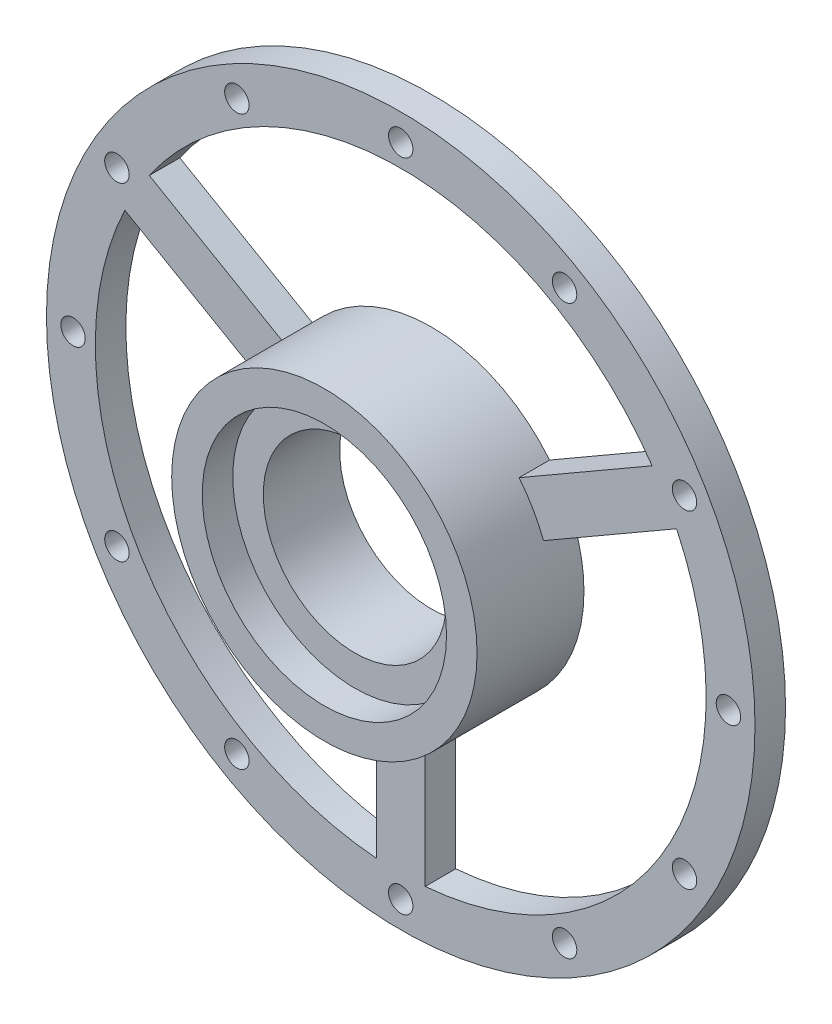
ISO-10303-21;
HEADER;
FILE_DESCRIPTION(('STEP AP214'),'2;1');
FILE_NAME('part.step','',(''),(''),'','','');
FILE_SCHEMA(('AUTOMOTIVE_DESIGN { 1 0 10303 214 1 1 1 1 }'));
ENDSEC;
DATA;
#1=APPLICATION_CONTEXT('core data for automotive mechanical design processes');
#2=APPLICATION_PROTOCOL_DEFINITION('international standard','automotive_design',2000,#1);
#3=PRODUCT_CONTEXT('',#1,'mechanical');
#4=PRODUCT('Part','Part','',(#3));
#5=PRODUCT_RELATED_PRODUCT_CATEGORY('part','',(#4));
#6=PRODUCT_DEFINITION_FORMATION('','',#4);
#7=PRODUCT_DEFINITION_CONTEXT('part definition',#1,'design');
#8=PRODUCT_DEFINITION('design','',#6,#7);
#9=PRODUCT_DEFINITION_SHAPE('','',#8);
#10=(LENGTH_UNIT() NAMED_UNIT(*) SI_UNIT(.MILLI.,.METRE.));
#11=(NAMED_UNIT(*) PLANE_ANGLE_UNIT() SI_UNIT($,.RADIAN.));
#12=(NAMED_UNIT(*) SI_UNIT($,.STERADIAN.) SOLID_ANGLE_UNIT());
#13=UNCERTAINTY_MEASURE_WITH_UNIT(LENGTH_MEASURE(1.E-05),#10,'distance_accuracy_value','');
#14=(GEOMETRIC_REPRESENTATION_CONTEXT(3) GLOBAL_UNCERTAINTY_ASSIGNED_CONTEXT((#13)) GLOBAL_UNIT_ASSIGNED_CONTEXT((#10,
#11,#12)) REPRESENTATION_CONTEXT('',''));
#15=CARTESIAN_POINT('',(0.,0.,0.));
#16=DIRECTION('',(0.,0.,1.));
#17=DIRECTION('',(1.,0.,0.));
#18=AXIS2_PLACEMENT_3D('',#15,#16,#17);
#19=CARTESIAN_POINT('',(0.,116.,0.));
#20=DIRECTION('',(0.,0.,1.));
#21=DIRECTION('',(1.,0.,0.));
#22=AXIS2_PLACEMENT_3D('',#19,#20,#21);
#23=PLANE('',#22);
#24=DIRECTION('',(-0.866025403784439,0.5,0.));
#25=VECTOR('',#24,1.);
#26=CARTESIAN_POINT('',(-4.00000000000001,-6.92820323027553,0.));
#27=LINE('',#26,#25);
#28=CARTESIAN_POINT('',(-46.743420546325,17.7497221282306,0.));
#29=VERTEX_POINT('',#28);
#30=CARTESIAN_POINT('',(-90.324967419629,42.9115399472329,0.));
#31=VERTEX_POINT('',#30);
#32=EDGE_CURVE('E173',#29,#31,#27,.T.);
#33=ORIENTED_EDGE('',*,*,#32,.T.);
#34=CARTESIAN_POINT('',(0.,0.,0.));
#35=DIRECTION('',(0.,0.,1.));
#36=DIRECTION('',(1.,0.,0.));
#37=AXIS2_PLACEMENT_3D('',#34,#35,#36);
#38=CIRCLE('',#37,100.);
#39=CARTESIAN_POINT('',(-7.99999999999963,-99.6794863550169,0.));
#40=VERTEX_POINT('',#39);
#41=EDGE_CURVE('E184',#40,#31,#38,.F.);
#42=ORIENTED_EDGE('',*,*,#41,.F.);
#43=DIRECTION('',(0.,-1.,0.));
#44=VECTOR('',#43,1.);
#45=CARTESIAN_POINT('',(-7.99999999999976,0.,0.));
#46=LINE('',#45,#44);
#47=CARTESIAN_POINT('',(-7.99999999999972,-49.3558507170123,0.));
#48=VERTEX_POINT('',#47);
#49=EDGE_CURVE('E103',#48,#40,#46,.T.);
#50=ORIENTED_EDGE('',*,*,#49,.F.);
#51=CARTESIAN_POINT('',(0.,0.,0.));
#52=DIRECTION('',(0.,0.,1.));
#53=DIRECTION('',(1.,0.,0.));
#54=AXIS2_PLACEMENT_3D('',#51,#52,#53);
#55=CIRCLE('',#54,50.);
#56=EDGE_CURVE('E192',#29,#48,#55,.T.);
#57=ORIENTED_EDGE('',*,*,#56,.F.);
#58=EDGE_LOOP('',(#33,#42,#50,#57));
#59=FACE_BOUND('',#58,.T.);
#60=CARTESIAN_POINT('',(0.,0.,0.));
#61=DIRECTION('',(0.,0.,1.));
#62=DIRECTION('',(1.,0.,0.));
#63=AXIS2_PLACEMENT_3D('',#60,#61,#62);
#64=CIRCLE('',#63,30.);
#65=CARTESIAN_POINT('',(30.,0.,0.));
#66=VERTEX_POINT('',#65);
#67=EDGE_CURVE('E12',#66,#66,#64,.T.);
#68=ORIENTED_EDGE('',*,*,#67,.T.);
#69=EDGE_LOOP('',(#68));
#70=FACE_BOUND('',#69,.T.);
#71=CARTESIAN_POINT('',(0.,0.,0.));
#72=DIRECTION('',(0.,0.,1.));
#73=DIRECTION('',(1.,0.,0.));
#74=AXIS2_PLACEMENT_3D('',#71,#72,#73);
#75=CIRCLE('',#74,116.);
#76=CARTESIAN_POINT('',(116.,0.,0.));
#77=VERTEX_POINT('',#76);
#78=EDGE_CURVE('E270',#77,#77,#75,.T.);
#79=ORIENTED_EDGE('',*,*,#78,.F.);
#80=EDGE_LOOP('',(#79));
#81=FACE_BOUND('',#80,.T.);
#82=CARTESIAN_POINT('',(92.9245258260702,53.6500000000001,0.));
#83=DIRECTION('',(0.,0.,1.));
#84=DIRECTION('',(1.,0.,0.));
#85=AXIS2_PLACEMENT_3D('',#82,#83,#84);
#86=CIRCLE('',#85,4.00000000000001);
#87=CARTESIAN_POINT('',(96.9245258260702,53.6500000000001,0.));
#88=VERTEX_POINT('',#87);
#89=EDGE_CURVE('E306',#88,#88,#86,.F.);
#90=ORIENTED_EDGE('',*,*,#89,.F.);
#91=EDGE_LOOP('',(#90));
#92=FACE_BOUND('',#91,.T.);
#93=CARTESIAN_POINT('',(53.65,92.9245258260703,0.));
#94=DIRECTION('',(0.,0.,1.));
#95=DIRECTION('',(1.,0.,0.));
#96=AXIS2_PLACEMENT_3D('',#93,#94,#95);
#97=CIRCLE('',#96,4.00000000000001);
#98=CARTESIAN_POINT('',(57.65,92.9245258260703,0.));
#99=VERTEX_POINT('',#98);
#100=EDGE_CURVE('E300',#99,#99,#97,.F.);
#101=ORIENTED_EDGE('',*,*,#100,.F.);
#102=EDGE_LOOP('',(#101));
#103=FACE_BOUND('',#102,.T.);
#104=CARTESIAN_POINT('',(0.,107.3,0.));
#105=DIRECTION('',(0.,0.,1.));
#106=DIRECTION('',(1.,0.,0.));
#107=AXIS2_PLACEMENT_3D('',#104,#105,#106);
#108=CIRCLE('',#107,4.);
#109=CARTESIAN_POINT('',(3.99999999999999,107.3,0.));
#110=VERTEX_POINT('',#109);
#111=EDGE_CURVE('E293',#110,#110,#108,.F.);
#112=ORIENTED_EDGE('',*,*,#111,.F.);
#113=EDGE_LOOP('',(#112));
#114=FACE_BOUND('',#113,.T.);
#115=CARTESIAN_POINT('',(-53.65,92.9245258260703,0.));
#116=DIRECTION('',(0.,0.,1.));
#117=DIRECTION('',(1.,0.,0.));
#118=AXIS2_PLACEMENT_3D('',#115,#116,#117);
#119=CIRCLE('',#118,4.00000000000001);
#120=CARTESIAN_POINT('',(-49.65,92.9245258260703,0.));
#121=VERTEX_POINT('',#120);
#122=EDGE_CURVE('E292',#121,#121,#119,.F.);
#123=ORIENTED_EDGE('',*,*,#122,.F.);
#124=EDGE_LOOP('',(#123));
#125=FACE_BOUND('',#124,.T.);
#126=CARTESIAN_POINT('',(-92.9245258260703,53.65,0.));
#127=DIRECTION('',(0.,0.,1.));
#128=DIRECTION('',(1.,0.,0.));
#129=AXIS2_PLACEMENT_3D('',#126,#127,#128);
#130=CIRCLE('',#129,4.00000000000001);
#131=CARTESIAN_POINT('',(-88.9245258260703,53.65,0.));
#132=VERTEX_POINT('',#131);
#133=EDGE_CURVE('E328',#132,#132,#130,.F.);
#134=ORIENTED_EDGE('',*,*,#133,.F.);
#135=EDGE_LOOP('',(#134));
#136=FACE_BOUND('',#135,.T.);
#137=CARTESIAN_POINT('',(-107.3,0.,0.));
#138=DIRECTION('',(0.,0.,1.));
#139=DIRECTION('',(1.,0.,0.));
#140=AXIS2_PLACEMENT_3D('',#137,#138,#139);
#141=CIRCLE('',#140,4.00000000000001);
#142=CARTESIAN_POINT('',(-103.3,0.,0.));
#143=VERTEX_POINT('',#142);
#144=EDGE_CURVE('E322',#143,#143,#141,.F.);
#145=ORIENTED_EDGE('',*,*,#144,.F.);
#146=EDGE_LOOP('',(#145));
#147=FACE_BOUND('',#146,.T.);
#148=CARTESIAN_POINT('',(-92.9245258260703,-53.65,0.));
#149=DIRECTION('',(0.,0.,1.));
#150=DIRECTION('',(1.,0.,0.));
#151=AXIS2_PLACEMENT_3D('',#148,#149,#150);
#152=CIRCLE('',#151,4.00000000000001);
#153=CARTESIAN_POINT('',(-88.9245258260703,-53.65,0.));
#154=VERTEX_POINT('',#153);
#155=EDGE_CURVE('E316',#154,#154,#152,.F.);
#156=ORIENTED_EDGE('',*,*,#155,.F.);
#157=EDGE_LOOP('',(#156));
#158=FACE_BOUND('',#157,.T.);
#159=CARTESIAN_POINT('',(-53.65,-92.9245258260702,0.));
#160=DIRECTION('',(0.,0.,1.));
#161=DIRECTION('',(1.,0.,0.));
#162=AXIS2_PLACEMENT_3D('',#159,#160,#161);
#163=CIRCLE('',#162,4.);
#164=CARTESIAN_POINT('',(-49.65,-92.9245258260702,0.));
#165=VERTEX_POINT('',#164);
#166=EDGE_CURVE('E267',#165,#165,#163,.F.);
#167=ORIENTED_EDGE('',*,*,#166,.F.);
#168=EDGE_LOOP('',(#167));
#169=FACE_BOUND('',#168,.T.);
#170=CARTESIAN_POINT('',(107.3,0.,0.));
#171=DIRECTION('',(0.,0.,1.));
#172=DIRECTION('',(1.,0.,0.));
#173=AXIS2_PLACEMENT_3D('',#170,#171,#172);
#174=CIRCLE('',#173,3.99999999999999);
#175=CARTESIAN_POINT('',(111.3,0.,0.));
#176=VERTEX_POINT('',#175);
#177=EDGE_CURVE('E274',#176,#176,#174,.F.);
#178=ORIENTED_EDGE('',*,*,#177,.F.);
#179=EDGE_LOOP('',(#178));
#180=FACE_BOUND('',#179,.T.);
#181=CARTESIAN_POINT('',(92.9245258260703,-53.6499999999999,0.));
#182=DIRECTION('',(0.,0.,1.));
#183=DIRECTION('',(1.,0.,0.));
#184=AXIS2_PLACEMENT_3D('',#181,#182,#183);
#185=CIRCLE('',#184,3.99999999999999);
#186=CARTESIAN_POINT('',(96.9245258260703,-53.6499999999999,0.));
#187=VERTEX_POINT('',#186);
#188=EDGE_CURVE('E275',#187,#187,#185,.F.);
#189=ORIENTED_EDGE('',*,*,#188,.F.);
#190=EDGE_LOOP('',(#189));
#191=FACE_BOUND('',#190,.T.);
#192=CARTESIAN_POINT('',(53.6500000000001,-92.9245258260702,0.));
#193=DIRECTION('',(0.,0.,1.));
#194=DIRECTION('',(1.,0.,0.));
#195=AXIS2_PLACEMENT_3D('',#192,#193,#194);
#196=CIRCLE('',#195,4.00000000000001);
#197=CARTESIAN_POINT('',(57.6500000000001,-92.9245258260702,0.));
#198=VERTEX_POINT('',#197);
#199=EDGE_CURVE('E282',#198,#198,#196,.F.);
#200=ORIENTED_EDGE('',*,*,#199,.F.);
#201=EDGE_LOOP('',(#200));
#202=FACE_BOUND('',#201,.T.);
#203=CARTESIAN_POINT('',(0.,-107.3,0.));
#204=DIRECTION('',(0.,0.,1.));
#205=DIRECTION('',(1.,0.,0.));
#206=AXIS2_PLACEMENT_3D('',#203,#204,#205);
#207=CIRCLE('',#206,4.);
#208=CARTESIAN_POINT('',(4.,-107.3,0.));
#209=VERTEX_POINT('',#208);
#210=EDGE_CURVE('E266',#209,#209,#207,.F.);
#211=ORIENTED_EDGE('',*,*,#210,.F.);
#212=EDGE_LOOP('',(#211));
#213=FACE_BOUND('',#212,.T.);
#214=DIRECTION('',(0.866025403784438,0.5,0.));
#215=VECTOR('',#214,1.);
#216=CARTESIAN_POINT('',(-3.99999999999983,6.92820323027521,0.));
#217=LINE('',#216,#215);
#218=CARTESIAN_POINT('',(38.7434205463252,31.6061285887814,0.));
#219=VERTEX_POINT('',#218);
#220=CARTESIAN_POINT('',(82.3249674196291,56.7679464077837,0.));
#221=VERTEX_POINT('',#220);
#222=EDGE_CURVE('E238',#219,#221,#217,.T.);
#223=ORIENTED_EDGE('',*,*,#222,.T.);
#224=CARTESIAN_POINT('',(0.,0.,0.));
#225=DIRECTION('',(0.,0.,1.));
#226=DIRECTION('',(1.,0.,0.));
#227=AXIS2_PLACEMENT_3D('',#224,#225,#226);
#228=CIRCLE('',#227,100.);
#229=CARTESIAN_POINT('',(-82.324967419629,56.767946407784,0.));
#230=VERTEX_POINT('',#229);
#231=EDGE_CURVE('E253',#230,#221,#228,.F.);
#232=ORIENTED_EDGE('',*,*,#231,.F.);
#233=DIRECTION('',(-0.866025403784439,0.5,0.));
#234=VECTOR('',#233,1.);
#235=CARTESIAN_POINT('',(3.99999999999999,6.9282032302755,0.));
#236=LINE('',#235,#234);
#237=CARTESIAN_POINT('',(-38.743420546325,31.6061285887816,0.));
#238=VERTEX_POINT('',#237);
#239=EDGE_CURVE('E187',#238,#230,#236,.T.);
#240=ORIENTED_EDGE('',*,*,#239,.F.);
#241=CARTESIAN_POINT('',(0.,0.,0.));
#242=DIRECTION('',(0.,0.,1.));
#243=DIRECTION('',(1.,0.,0.));
#244=AXIS2_PLACEMENT_3D('',#241,#242,#243);
#245=CIRCLE('',#244,50.);
#246=EDGE_CURVE('E235',#219,#238,#245,.T.);
#247=ORIENTED_EDGE('',*,*,#246,.F.);
#248=EDGE_LOOP('',(#223,#232,#240,#247));
#249=FACE_BOUND('',#248,.T.);
#250=DIRECTION('',(0.,-1.,0.));
#251=VECTOR('',#250,1.);
#252=CARTESIAN_POINT('',(8.00000000000026,0.,0.));
#253=LINE('',#252,#251);
#254=CARTESIAN_POINT('',(8.0000000000003,-49.3558507170122,0.));
#255=VERTEX_POINT('',#254);
#256=CARTESIAN_POINT('',(8.00000000000029,-99.6794863550169,0.));
#257=VERTEX_POINT('',#256);
#258=EDGE_CURVE('E210',#255,#257,#253,.T.);
#259=ORIENTED_EDGE('',*,*,#258,.T.);
#260=CARTESIAN_POINT('',(0.,0.,0.));
#261=DIRECTION('',(0.,0.,1.));
#262=DIRECTION('',(1.,0.,0.));
#263=AXIS2_PLACEMENT_3D('',#260,#261,#262);
#264=CIRCLE('',#263,100.);
#265=CARTESIAN_POINT('',(90.3249674196291,42.9115399472327,0.));
#266=VERTEX_POINT('',#265);
#267=EDGE_CURVE('E225',#266,#257,#264,.F.);
#268=ORIENTED_EDGE('',*,*,#267,.F.);
#269=DIRECTION('',(0.866025403784438,0.500000000000001,0.));
#270=VECTOR('',#269,1.);
#271=CARTESIAN_POINT('',(4.0000000000002,-6.92820323027584,0.));
#272=LINE('',#271,#270);
#273=CARTESIAN_POINT('',(46.7434205463252,17.7497221282303,0.));
#274=VERTEX_POINT('',#273);
#275=EDGE_CURVE('E95',#274,#266,#272,.T.);
#276=ORIENTED_EDGE('',*,*,#275,.F.);
#277=CARTESIAN_POINT('',(0.,0.,0.));
#278=DIRECTION('',(0.,0.,1.));
#279=DIRECTION('',(1.,0.,0.));
#280=AXIS2_PLACEMENT_3D('',#277,#278,#279);
#281=CIRCLE('',#280,50.);
#282=EDGE_CURVE('E207',#255,#274,#281,.T.);
#283=ORIENTED_EDGE('',*,*,#282,.F.);
#284=EDGE_LOOP('',(#259,#268,#276,#283));
#285=FACE_BOUND('',#284,.T.);
#286=ADVANCED_FACE('F81',(#59,#70,#81,#92,#103,#114,#125,#136,#147,#158,#169,#180,#191,#202,
#213,#249,#285),#23,.F.);
#287=CARTESIAN_POINT('',(0.,50.,10.));
#288=DIRECTION('',(0.,0.,-1.));
#289=DIRECTION('',(-1.,0.,0.));
#290=AXIS2_PLACEMENT_3D('',#287,#288,#289);
#291=PLANE('',#290);
#292=CARTESIAN_POINT('',(0.,0.,10.));
#293=DIRECTION('',(0.,0.,1.));
#294=DIRECTION('',(1.,0.,0.));
#295=AXIS2_PLACEMENT_3D('',#292,#293,#294);
#296=CIRCLE('',#295,116.);
#297=CARTESIAN_POINT('',(116.,0.,10.));
#298=VERTEX_POINT('',#297);
#299=EDGE_CURVE('E337',#298,#298,#296,.T.);
#300=ORIENTED_EDGE('',*,*,#299,.T.);
#301=EDGE_LOOP('',(#300));
#302=FACE_BOUND('',#301,.T.);
#303=CARTESIAN_POINT('',(92.9245258260702,53.6500000000001,10.));
#304=DIRECTION('',(0.,0.,1.));
#305=DIRECTION('',(1.,0.,0.));
#306=AXIS2_PLACEMENT_3D('',#303,#304,#305);
#307=CIRCLE('',#306,4.00000000000001);
#308=CARTESIAN_POINT('',(96.9245258260702,53.6500000000001,10.));
#309=VERTEX_POINT('',#308);
#310=EDGE_CURVE('E278',#309,#309,#307,.T.);
#311=ORIENTED_EDGE('',*,*,#310,.F.);
#312=EDGE_LOOP('',(#311));
#313=FACE_BOUND('',#312,.T.);
#314=CARTESIAN_POINT('',(53.65,92.9245258260703,10.));
#315=DIRECTION('',(0.,0.,1.));
#316=DIRECTION('',(1.,0.,0.));
#317=AXIS2_PLACEMENT_3D('',#314,#315,#316);
#318=CIRCLE('',#317,4.00000000000001);
#319=CARTESIAN_POINT('',(57.65,92.9245258260703,10.));
#320=VERTEX_POINT('',#319);
#321=EDGE_CURVE('E303',#320,#320,#318,.T.);
#322=ORIENTED_EDGE('',*,*,#321,.F.);
#323=EDGE_LOOP('',(#322));
#324=FACE_BOUND('',#323,.T.);
#325=CARTESIAN_POINT('',(0.,107.3,10.));
#326=DIRECTION('',(0.,0.,1.));
#327=DIRECTION('',(1.,0.,0.));
#328=AXIS2_PLACEMENT_3D('',#325,#326,#327);
#329=CIRCLE('',#328,4.);
#330=CARTESIAN_POINT('',(3.99999999999999,107.3,10.));
#331=VERTEX_POINT('',#330);
#332=EDGE_CURVE('E297',#331,#331,#329,.T.);
#333=ORIENTED_EDGE('',*,*,#332,.F.);
#334=EDGE_LOOP('',(#333));
#335=FACE_BOUND('',#334,.T.);
#336=CARTESIAN_POINT('',(-53.65,92.9245258260703,10.));
#337=DIRECTION('',(0.,0.,1.));
#338=DIRECTION('',(1.,0.,0.));
#339=AXIS2_PLACEMENT_3D('',#336,#337,#338);
#340=CIRCLE('',#339,4.00000000000001);
#341=CARTESIAN_POINT('',(-49.65,92.9245258260703,10.));
#342=VERTEX_POINT('',#341);
#343=EDGE_CURVE('E289',#342,#342,#340,.T.);
#344=ORIENTED_EDGE('',*,*,#343,.F.);
#345=EDGE_LOOP('',(#344));
#346=FACE_BOUND('',#345,.T.);
#347=CARTESIAN_POINT('',(-92.9245258260703,53.65,10.));
#348=DIRECTION('',(0.,0.,1.));
#349=DIRECTION('',(1.,0.,0.));
#350=AXIS2_PLACEMENT_3D('',#347,#348,#349);
#351=CIRCLE('',#350,4.00000000000001);
#352=CARTESIAN_POINT('',(-88.9245258260703,53.65,10.));
#353=VERTEX_POINT('',#352);
#354=EDGE_CURVE('E296',#353,#353,#351,.T.);
#355=ORIENTED_EDGE('',*,*,#354,.F.);
#356=EDGE_LOOP('',(#355));
#357=FACE_BOUND('',#356,.T.);
#358=CARTESIAN_POINT('',(-107.3,0.,10.));
#359=DIRECTION('',(0.,0.,1.));
#360=DIRECTION('',(1.,0.,0.));
#361=AXIS2_PLACEMENT_3D('',#358,#359,#360);
#362=CIRCLE('',#361,4.00000000000001);
#363=CARTESIAN_POINT('',(-103.3,0.,10.));
#364=VERTEX_POINT('',#363);
#365=EDGE_CURVE('E325',#364,#364,#362,.T.);
#366=ORIENTED_EDGE('',*,*,#365,.F.);
#367=EDGE_LOOP('',(#366));
#368=FACE_BOUND('',#367,.T.);
#369=CARTESIAN_POINT('',(-92.9245258260703,-53.65,10.));
#370=DIRECTION('',(0.,0.,1.));
#371=DIRECTION('',(1.,0.,0.));
#372=AXIS2_PLACEMENT_3D('',#369,#370,#371);
#373=CIRCLE('',#372,4.00000000000001);
#374=CARTESIAN_POINT('',(-88.9245258260703,-53.65,10.));
#375=VERTEX_POINT('',#374);
#376=EDGE_CURVE('E319',#375,#375,#373,.T.);
#377=ORIENTED_EDGE('',*,*,#376,.F.);
#378=EDGE_LOOP('',(#377));
#379=FACE_BOUND('',#378,.T.);
#380=CARTESIAN_POINT('',(-53.65,-92.9245258260702,10.));
#381=DIRECTION('',(0.,0.,1.));
#382=DIRECTION('',(1.,0.,0.));
#383=AXIS2_PLACEMENT_3D('',#380,#381,#382);
#384=CIRCLE('',#383,4.);
#385=CARTESIAN_POINT('',(-49.65,-92.9245258260702,10.));
#386=VERTEX_POINT('',#385);
#387=EDGE_CURVE('E313',#386,#386,#384,.T.);
#388=ORIENTED_EDGE('',*,*,#387,.F.);
#389=EDGE_LOOP('',(#388));
#390=FACE_BOUND('',#389,.T.);
#391=CARTESIAN_POINT('',(107.3,0.,10.));
#392=DIRECTION('',(0.,0.,1.));
#393=DIRECTION('',(1.,0.,0.));
#394=AXIS2_PLACEMENT_3D('',#391,#392,#393);
#395=CIRCLE('',#394,3.99999999999999);
#396=CARTESIAN_POINT('',(111.3,0.,10.));
#397=VERTEX_POINT('',#396);
#398=EDGE_CURVE('E271',#397,#397,#395,.T.);
#399=ORIENTED_EDGE('',*,*,#398,.F.);
#400=EDGE_LOOP('',(#399));
#401=FACE_BOUND('',#400,.T.);
#402=CARTESIAN_POINT('',(92.9245258260703,-53.6499999999999,10.));
#403=DIRECTION('',(0.,0.,1.));
#404=DIRECTION('',(1.,0.,0.));
#405=AXIS2_PLACEMENT_3D('',#402,#403,#404);
#406=CIRCLE('',#405,3.99999999999999);
#407=CARTESIAN_POINT('',(96.9245258260703,-53.6499999999999,10.));
#408=VERTEX_POINT('',#407);
#409=EDGE_CURVE('E279',#408,#408,#406,.T.);
#410=ORIENTED_EDGE('',*,*,#409,.F.);
#411=EDGE_LOOP('',(#410));
#412=FACE_BOUND('',#411,.T.);
#413=CARTESIAN_POINT('',(53.6500000000001,-92.9245258260702,10.));
#414=DIRECTION('',(0.,0.,1.));
#415=DIRECTION('',(1.,0.,0.));
#416=AXIS2_PLACEMENT_3D('',#413,#414,#415);
#417=CIRCLE('',#416,4.00000000000001);
#418=CARTESIAN_POINT('',(57.6500000000001,-92.9245258260702,10.));
#419=VERTEX_POINT('',#418);
#420=EDGE_CURVE('E262',#419,#419,#417,.T.);
#421=ORIENTED_EDGE('',*,*,#420,.F.);
#422=EDGE_LOOP('',(#421));
#423=FACE_BOUND('',#422,.T.);
#424=CARTESIAN_POINT('',(0.,-107.3,10.));
#425=DIRECTION('',(0.,0.,1.));
#426=DIRECTION('',(1.,0.,0.));
#427=AXIS2_PLACEMENT_3D('',#424,#425,#426);
#428=CIRCLE('',#427,4.);
#429=CARTESIAN_POINT('',(4.,-107.3,10.));
#430=VERTEX_POINT('',#429);
#431=EDGE_CURVE('E263',#430,#430,#428,.T.);
#432=ORIENTED_EDGE('',*,*,#431,.F.);
#433=EDGE_LOOP('',(#432));
#434=FACE_BOUND('',#433,.T.);
#435=DIRECTION('',(0.,1.,0.));
#436=VECTOR('',#435,1.);
#437=CARTESIAN_POINT('',(8.00000000000026,0.,10.));
#438=LINE('',#437,#436);
#439=CARTESIAN_POINT('',(8.00000000000028,-99.6794863550169,10.));
#440=VERTEX_POINT('',#439);
#441=CARTESIAN_POINT('',(8.0000000000003,-49.3558507170122,10.));
#442=VERTEX_POINT('',#441);
#443=EDGE_CURVE('E213',#440,#442,#438,.T.);
#444=ORIENTED_EDGE('',*,*,#443,.T.);
#445=CARTESIAN_POINT('',(0.,0.,10.));
#446=DIRECTION('',(0.,0.,1.));
#447=DIRECTION('',(1.,0.,0.));
#448=AXIS2_PLACEMENT_3D('',#445,#446,#447);
#449=CIRCLE('',#448,50.);
#450=CARTESIAN_POINT('',(-7.99999999999972,-49.3558507170123,10.));
#451=VERTEX_POINT('',#450);
#452=EDGE_CURVE('E340',#451,#442,#449,.T.);
#453=ORIENTED_EDGE('',*,*,#452,.F.);
#454=DIRECTION('',(0.,1.,0.));
#455=VECTOR('',#454,1.);
#456=CARTESIAN_POINT('',(-7.99999999999976,0.,10.));
#457=LINE('',#456,#455);
#458=CARTESIAN_POINT('',(-7.99999999999967,-99.6794863550175,10.));
#459=VERTEX_POINT('',#458);
#460=EDGE_CURVE('E181',#459,#451,#457,.T.);
#461=ORIENTED_EDGE('',*,*,#460,.F.);
#462=CARTESIAN_POINT('',(0.,0.,10.));
#463=DIRECTION('',(0.,0.,1.));
#464=DIRECTION('',(1.,0.,0.));
#465=AXIS2_PLACEMENT_3D('',#462,#463,#464);
#466=CIRCLE('',#465,100.);
#467=CARTESIAN_POINT('',(-90.324967419629,42.9115399472329,10.));
#468=VERTEX_POINT('',#467);
#469=EDGE_CURVE('E194',#468,#459,#466,.T.);
#470=ORIENTED_EDGE('',*,*,#469,.F.);
#471=DIRECTION('',(0.866025403784439,-0.5,0.));
#472=VECTOR('',#471,1.);
#473=CARTESIAN_POINT('',(-4.00000000000001,-6.92820323027553,10.));
#474=LINE('',#473,#472);
#475=CARTESIAN_POINT('',(-46.743420546325,17.7497221282306,10.));
#476=VERTEX_POINT('',#475);
#477=EDGE_CURVE('E176',#468,#476,#474,.T.);
#478=ORIENTED_EDGE('',*,*,#477,.T.);
#479=CARTESIAN_POINT('',(-38.743420546325,31.6061285887816,10.));
#480=VERTEX_POINT('',#479);
#481=EDGE_CURVE('E345',#480,#476,#449,.T.);
#482=ORIENTED_EDGE('',*,*,#481,.F.);
#483=DIRECTION('',(0.866025403784439,-0.5,0.));
#484=VECTOR('',#483,1.);
#485=CARTESIAN_POINT('',(3.99999999999999,6.9282032302755,10.));
#486=LINE('',#485,#484);
#487=CARTESIAN_POINT('',(-82.324967419629,56.7679464077839,10.));
#488=VERTEX_POINT('',#487);
#489=EDGE_CURVE('E247',#488,#480,#486,.T.);
#490=ORIENTED_EDGE('',*,*,#489,.F.);
#491=CARTESIAN_POINT('',(0.,0.,10.));
#492=DIRECTION('',(0.,0.,1.));
#493=DIRECTION('',(1.,0.,0.));
#494=AXIS2_PLACEMENT_3D('',#491,#492,#493);
#495=CIRCLE('',#494,100.);
#496=CARTESIAN_POINT('',(82.3249674196291,56.7679464077837,10.));
#497=VERTEX_POINT('',#496);
#498=EDGE_CURVE('E244',#497,#488,#495,.T.);
#499=ORIENTED_EDGE('',*,*,#498,.F.);
#500=DIRECTION('',(-0.866025403784438,-0.5,0.));
#501=VECTOR('',#500,1.);
#502=CARTESIAN_POINT('',(-3.99999999999983,6.92820323027521,10.));
#503=LINE('',#502,#501);
#504=CARTESIAN_POINT('',(38.7434205463252,31.6061285887814,10.));
#505=VERTEX_POINT('',#504);
#506=EDGE_CURVE('E241',#497,#505,#503,.T.);
#507=ORIENTED_EDGE('',*,*,#506,.T.);
#508=CARTESIAN_POINT('',(46.7434205463252,17.7497221282303,10.));
#509=VERTEX_POINT('',#508);
#510=EDGE_CURVE('E341',#509,#505,#449,.T.);
#511=ORIENTED_EDGE('',*,*,#510,.F.);
#512=DIRECTION('',(-0.866025403784438,-0.500000000000001,0.));
#513=VECTOR('',#512,1.);
#514=CARTESIAN_POINT('',(4.0000000000002,-6.92820323027584,10.));
#515=LINE('',#514,#513);
#516=CARTESIAN_POINT('',(90.3249674196296,42.9115399472329,10.));
#517=VERTEX_POINT('',#516);
#518=EDGE_CURVE('E219',#517,#509,#515,.T.);
#519=ORIENTED_EDGE('',*,*,#518,.F.);
#520=CARTESIAN_POINT('',(0.,0.,10.));
#521=DIRECTION('',(0.,0.,1.));
#522=DIRECTION('',(1.,0.,0.));
#523=AXIS2_PLACEMENT_3D('',#520,#521,#522);
#524=CIRCLE('',#523,100.);
#525=EDGE_CURVE('E216',#440,#517,#524,.T.);
#526=ORIENTED_EDGE('',*,*,#525,.F.);
#527=EDGE_LOOP('',(#444,#453,#461,#470,#478,#482,#490,#499,#507,#511,#519,#526));
#528=FACE_BOUND('',#527,.T.);
#529=ADVANCED_FACE('F385',(#302,#313,#324,#335,#346,#357,#368,#379,#390,#401,#412,#423,#434,
#528),#291,.F.);
#530=CARTESIAN_POINT('',(0.,0.,100.));
#531=DIRECTION('',(0.,0.,1.));
#532=DIRECTION('',(1.,0.,0.));
#533=AXIS2_PLACEMENT_3D('',#530,#531,#532);
#534=CYLINDRICAL_SURFACE('',#533,30.);
#535=ORIENTED_EDGE('',*,*,#67,.F.);
#536=EDGE_LOOP('',(#535));
#537=FACE_BOUND('',#536,.T.);
#538=CARTESIAN_POINT('',(0.,0.,25.));
#539=DIRECTION('',(0.,0.,1.));
#540=DIRECTION('',(1.,0.,0.));
#541=AXIS2_PLACEMENT_3D('',#538,#539,#540);
#542=CIRCLE('',#541,30.);
#543=CARTESIAN_POINT('',(30.,0.,25.));
#544=VERTEX_POINT('',#543);
#545=EDGE_CURVE('E88',#544,#544,#542,.T.);
#546=ORIENTED_EDGE('',*,*,#545,.T.);
#547=EDGE_LOOP('',(#546));
#548=FACE_BOUND('',#547,.T.);
#549=ADVANCED_FACE('F356',(#537,#548),#534,.F.);
#550=CARTESIAN_POINT('',(0.,30.,25.));
#551=DIRECTION('',(0.,0.,-1.));
#552=DIRECTION('',(-1.,0.,0.));
#553=AXIS2_PLACEMENT_3D('',#550,#551,#552);
#554=PLANE('',#553);
#555=ORIENTED_EDGE('',*,*,#545,.F.);
#556=EDGE_LOOP('',(#555));
#557=FACE_BOUND('',#556,.T.);
#558=CARTESIAN_POINT('',(0.,0.,25.));
#559=DIRECTION('',(0.,0.,1.));
#560=DIRECTION('',(1.,0.,0.));
#561=AXIS2_PLACEMENT_3D('',#558,#559,#560);
#562=CIRCLE('',#561,40.);
#563=CARTESIAN_POINT('',(40.,0.,25.));
#564=VERTEX_POINT('',#563);
#565=EDGE_CURVE('E351',#564,#564,#562,.T.);
#566=ORIENTED_EDGE('',*,*,#565,.T.);
#567=EDGE_LOOP('',(#566));
#568=FACE_BOUND('',#567,.T.);
#569=ADVANCED_FACE('F358',(#557,#568),#554,.F.);
#570=CARTESIAN_POINT('',(0.,0.,100.));
#571=DIRECTION('',(0.,0.,1.));
#572=DIRECTION('',(1.,0.,0.));
#573=AXIS2_PLACEMENT_3D('',#570,#571,#572);
#574=CYLINDRICAL_SURFACE('',#573,40.);
#575=ORIENTED_EDGE('',*,*,#565,.F.);
#576=EDGE_LOOP('',(#575));
#577=FACE_BOUND('',#576,.T.);
#578=CARTESIAN_POINT('',(0.,0.,35.));
#579=DIRECTION('',(0.,0.,1.));
#580=DIRECTION('',(1.,0.,0.));
#581=AXIS2_PLACEMENT_3D('',#578,#579,#580);
#582=CIRCLE('',#581,40.);
#583=CARTESIAN_POINT('',(40.,0.,35.));
#584=VERTEX_POINT('',#583);
#585=EDGE_CURVE('E348',#584,#584,#582,.T.);
#586=ORIENTED_EDGE('',*,*,#585,.T.);
#587=EDGE_LOOP('',(#586));
#588=FACE_BOUND('',#587,.T.);
#589=ADVANCED_FACE('F361',(#577,#588),#574,.F.);
#590=CARTESIAN_POINT('',(0.,40.,35.));
#591=DIRECTION('',(0.,0.,-1.));
#592=DIRECTION('',(-1.,0.,0.));
#593=AXIS2_PLACEMENT_3D('',#590,#591,#592);
#594=PLANE('',#593);
#595=ORIENTED_EDGE('',*,*,#585,.F.);
#596=EDGE_LOOP('',(#595));
#597=FACE_BOUND('',#596,.T.);
#598=CARTESIAN_POINT('',(0.,0.,35.));
#599=DIRECTION('',(0.,0.,1.));
#600=DIRECTION('',(1.,0.,0.));
#601=AXIS2_PLACEMENT_3D('',#598,#599,#600);
#602=CIRCLE('',#601,50.);
#603=CARTESIAN_POINT('',(50.,0.,35.));
#604=VERTEX_POINT('',#603);
#605=EDGE_CURVE('E344',#604,#604,#602,.T.);
#606=ORIENTED_EDGE('',*,*,#605,.T.);
#607=EDGE_LOOP('',(#606));
#608=FACE_BOUND('',#607,.T.);
#609=ADVANCED_FACE('F367',(#597,#608),#594,.F.);
#610=CARTESIAN_POINT('',(0.,0.,100.));
#611=DIRECTION('',(0.,0.,1.));
#612=DIRECTION('',(1.,0.,0.));
#613=AXIS2_PLACEMENT_3D('',#610,#611,#612);
#614=CYLINDRICAL_SURFACE('',#613,50.);
#615=ORIENTED_EDGE('',*,*,#605,.F.);
#616=EDGE_LOOP('',(#615));
#617=FACE_BOUND('',#616,.T.);
#618=ORIENTED_EDGE('',*,*,#510,.T.);
#619=DIRECTION('',(0.,0.,1.));
#620=VECTOR('',#619,1.);
#621=CARTESIAN_POINT('',(38.7434205463252,31.6061285887814,-0.000999999999999265));
#622=LINE('',#621,#620);
#623=EDGE_CURVE('E251',#219,#505,#622,.T.);
#624=ORIENTED_EDGE('',*,*,#623,.F.);
#625=ORIENTED_EDGE('',*,*,#246,.T.);
#626=DIRECTION('',(0.,0.,1.));
#627=VECTOR('',#626,1.);
#628=CARTESIAN_POINT('',(-38.743420546325,31.6061285887816,-0.000999999999999265));
#629=LINE('',#628,#627);
#630=EDGE_CURVE('E254',#238,#480,#629,.T.);
#631=ORIENTED_EDGE('',*,*,#630,.T.);
#632=ORIENTED_EDGE('',*,*,#481,.T.);
#633=DIRECTION('',(0.,0.,1.));
#634=VECTOR('',#633,1.);
#635=CARTESIAN_POINT('',(-46.743420546325,17.7497221282306,-0.000999999999999265));
#636=LINE('',#635,#634);
#637=EDGE_CURVE('E188',#29,#476,#636,.T.);
#638=ORIENTED_EDGE('',*,*,#637,.F.);
#639=ORIENTED_EDGE('',*,*,#56,.T.);
#640=DIRECTION('',(0.,0.,1.));
#641=VECTOR('',#640,1.);
#642=CARTESIAN_POINT('',(-7.99999999999972,-49.3558507170123,-0.000999999999999265));
#643=LINE('',#642,#641);
#644=EDGE_CURVE('E203',#48,#451,#643,.T.);
#645=ORIENTED_EDGE('',*,*,#644,.T.);
#646=ORIENTED_EDGE('',*,*,#452,.T.);
#647=DIRECTION('',(0.,0.,1.));
#648=VECTOR('',#647,1.);
#649=CARTESIAN_POINT('',(8.0000000000003,-49.3558507170122,-0.000999999999999265));
#650=LINE('',#649,#648);
#651=EDGE_CURVE('E223',#255,#442,#650,.T.);
#652=ORIENTED_EDGE('',*,*,#651,.F.);
#653=ORIENTED_EDGE('',*,*,#282,.T.);
#654=DIRECTION('',(0.,0.,1.));
#655=VECTOR('',#654,1.);
#656=CARTESIAN_POINT('',(46.7434205463252,17.7497221282303,-0.000999999999999265));
#657=LINE('',#656,#655);
#658=EDGE_CURVE('E226',#274,#509,#657,.T.);
#659=ORIENTED_EDGE('',*,*,#658,.T.);
#660=EDGE_LOOP('',(#618,#624,#625,#631,#632,#638,#639,#645,#646,#652,#653,#659));
#661=FACE_BOUND('',#660,.T.);
#662=ADVANCED_FACE('F373',(#617,#661),#614,.T.);
#663=CARTESIAN_POINT('',(0.,0.,100.));
#664=DIRECTION('',(0.,0.,1.));
#665=DIRECTION('',(1.,0.,0.));
#666=AXIS2_PLACEMENT_3D('',#663,#664,#665);
#667=CYLINDRICAL_SURFACE('',#666,116.);
#668=ORIENTED_EDGE('',*,*,#299,.F.);
#669=EDGE_LOOP('',(#668));
#670=FACE_BOUND('',#669,.T.);
#671=ORIENTED_EDGE('',*,*,#78,.T.);
#672=EDGE_LOOP('',(#671));
#673=FACE_BOUND('',#672,.T.);
#674=ADVANCED_FACE('F379',(#670,#673),#667,.T.);
#675=CARTESIAN_POINT('',(92.9245258260702,53.6500000000001,-0.000999999999999265));
#676=DIRECTION('',(0.,0.,1.));
#677=DIRECTION('',(1.,0.,0.));
#678=AXIS2_PLACEMENT_3D('',#675,#676,#677);
#679=CYLINDRICAL_SURFACE('',#678,4.00000000000001);
#680=ORIENTED_EDGE('',*,*,#310,.T.);
#681=EDGE_LOOP('',(#680));
#682=FACE_BOUND('',#681,.T.);
#683=ORIENTED_EDGE('',*,*,#89,.T.);
#684=EDGE_LOOP('',(#683));
#685=FACE_BOUND('',#684,.T.);
#686=ADVANCED_FACE('F427',(#682,#685),#679,.F.);
#687=CARTESIAN_POINT('',(53.65,92.9245258260703,-0.000999999999999265));
#688=DIRECTION('',(0.,0.,1.));
#689=DIRECTION('',(1.,0.,0.));
#690=AXIS2_PLACEMENT_3D('',#687,#688,#689);
#691=CYLINDRICAL_SURFACE('',#690,4.00000000000001);
#692=ORIENTED_EDGE('',*,*,#321,.T.);
#693=EDGE_LOOP('',(#692));
#694=FACE_BOUND('',#693,.T.);
#695=ORIENTED_EDGE('',*,*,#100,.T.);
#696=EDGE_LOOP('',(#695));
#697=FACE_BOUND('',#696,.T.);
#698=ADVANCED_FACE('F449',(#694,#697),#691,.F.);
#699=CARTESIAN_POINT('',(0.,107.3,-0.000999999999999265));
#700=DIRECTION('',(0.,0.,1.));
#701=DIRECTION('',(1.,0.,0.));
#702=AXIS2_PLACEMENT_3D('',#699,#700,#701);
#703=CYLINDRICAL_SURFACE('',#702,4.);
#704=ORIENTED_EDGE('',*,*,#332,.T.);
#705=EDGE_LOOP('',(#704));
#706=FACE_BOUND('',#705,.T.);
#707=ORIENTED_EDGE('',*,*,#111,.T.);
#708=EDGE_LOOP('',(#707));
#709=FACE_BOUND('',#708,.T.);
#710=ADVANCED_FACE('F453',(#706,#709),#703,.F.);
#711=CARTESIAN_POINT('',(-53.65,92.9245258260703,-0.000999999999999265));
#712=DIRECTION('',(0.,0.,1.));
#713=DIRECTION('',(1.,0.,0.));
#714=AXIS2_PLACEMENT_3D('',#711,#712,#713);
#715=CYLINDRICAL_SURFACE('',#714,4.00000000000001);
#716=ORIENTED_EDGE('',*,*,#343,.T.);
#717=EDGE_LOOP('',(#716));
#718=FACE_BOUND('',#717,.T.);
#719=ORIENTED_EDGE('',*,*,#122,.T.);
#720=EDGE_LOOP('',(#719));
#721=FACE_BOUND('',#720,.T.);
#722=ADVANCED_FACE('F433',(#718,#721),#715,.F.);
#723=CARTESIAN_POINT('',(-92.9245258260703,53.65,-0.000999999999999265));
#724=DIRECTION('',(0.,0.,1.));
#725=DIRECTION('',(1.,0.,0.));
#726=AXIS2_PLACEMENT_3D('',#723,#724,#725);
#727=CYLINDRICAL_SURFACE('',#726,4.00000000000001);
#728=ORIENTED_EDGE('',*,*,#354,.T.);
#729=EDGE_LOOP('',(#728));
#730=FACE_BOUND('',#729,.T.);
#731=ORIENTED_EDGE('',*,*,#133,.T.);
#732=EDGE_LOOP('',(#731));
#733=FACE_BOUND('',#732,.T.);
#734=ADVANCED_FACE('F429',(#730,#733),#727,.F.);
#735=CARTESIAN_POINT('',(-107.3,0.,-0.000999999999999265));
#736=DIRECTION('',(0.,0.,1.));
#737=DIRECTION('',(1.,0.,0.));
#738=AXIS2_PLACEMENT_3D('',#735,#736,#737);
#739=CYLINDRICAL_SURFACE('',#738,4.00000000000001);
#740=ORIENTED_EDGE('',*,*,#365,.T.);
#741=EDGE_LOOP('',(#740));
#742=FACE_BOUND('',#741,.T.);
#743=ORIENTED_EDGE('',*,*,#144,.T.);
#744=EDGE_LOOP('',(#743));
#745=FACE_BOUND('',#744,.T.);
#746=ADVANCED_FACE('F432',(#742,#745),#739,.F.);
#747=CARTESIAN_POINT('',(-92.9245258260703,-53.65,-0.000999999999999265));
#748=DIRECTION('',(0.,0.,1.));
#749=DIRECTION('',(1.,0.,0.));
#750=AXIS2_PLACEMENT_3D('',#747,#748,#749);
#751=CYLINDRICAL_SURFACE('',#750,4.00000000000001);
#752=ORIENTED_EDGE('',*,*,#376,.T.);
#753=EDGE_LOOP('',(#752));
#754=FACE_BOUND('',#753,.T.);
#755=ORIENTED_EDGE('',*,*,#155,.T.);
#756=EDGE_LOOP('',(#755));
#757=FACE_BOUND('',#756,.T.);
#758=ADVANCED_FACE('F437',(#754,#757),#751,.F.);
#759=CARTESIAN_POINT('',(-53.65,-92.9245258260702,-0.000999999999999265));
#760=DIRECTION('',(0.,0.,1.));
#761=DIRECTION('',(1.,0.,0.));
#762=AXIS2_PLACEMENT_3D('',#759,#760,#761);
#763=CYLINDRICAL_SURFACE('',#762,4.);
#764=ORIENTED_EDGE('',*,*,#387,.T.);
#765=EDGE_LOOP('',(#764));
#766=FACE_BOUND('',#765,.T.);
#767=ORIENTED_EDGE('',*,*,#166,.T.);
#768=EDGE_LOOP('',(#767));
#769=FACE_BOUND('',#768,.T.);
#770=ADVANCED_FACE('F441',(#766,#769),#763,.F.);
#771=CARTESIAN_POINT('',(107.3,0.,-0.000999999999999265));
#772=DIRECTION('',(0.,0.,1.));
#773=DIRECTION('',(1.,0.,0.));
#774=AXIS2_PLACEMENT_3D('',#771,#772,#773);
#775=CYLINDRICAL_SURFACE('',#774,3.99999999999999);
#776=ORIENTED_EDGE('',*,*,#398,.T.);
#777=EDGE_LOOP('',(#776));
#778=FACE_BOUND('',#777,.T.);
#779=ORIENTED_EDGE('',*,*,#177,.T.);
#780=EDGE_LOOP('',(#779));
#781=FACE_BOUND('',#780,.T.);
#782=ADVANCED_FACE('F445',(#778,#781),#775,.F.);
#783=CARTESIAN_POINT('',(92.9245258260703,-53.6499999999999,-0.000999999999999265));
#784=DIRECTION('',(0.,0.,1.));
#785=DIRECTION('',(1.,0.,0.));
#786=AXIS2_PLACEMENT_3D('',#783,#784,#785);
#787=CYLINDRICAL_SURFACE('',#786,3.99999999999999);
#788=ORIENTED_EDGE('',*,*,#409,.T.);
#789=EDGE_LOOP('',(#788));
#790=FACE_BOUND('',#789,.T.);
#791=ORIENTED_EDGE('',*,*,#188,.T.);
#792=EDGE_LOOP('',(#791));
#793=FACE_BOUND('',#792,.T.);
#794=ADVANCED_FACE('F465',(#790,#793),#787,.F.);
#795=CARTESIAN_POINT('',(53.6500000000001,-92.9245258260702,-0.000999999999999265));
#796=DIRECTION('',(0.,0.,1.));
#797=DIRECTION('',(1.,0.,0.));
#798=AXIS2_PLACEMENT_3D('',#795,#796,#797);
#799=CYLINDRICAL_SURFACE('',#798,4.00000000000001);
#800=ORIENTED_EDGE('',*,*,#420,.T.);
#801=EDGE_LOOP('',(#800));
#802=FACE_BOUND('',#801,.T.);
#803=ORIENTED_EDGE('',*,*,#199,.T.);
#804=EDGE_LOOP('',(#803));
#805=FACE_BOUND('',#804,.T.);
#806=ADVANCED_FACE('F461',(#802,#805),#799,.F.);
#807=CARTESIAN_POINT('',(0.,-107.3,-0.000999999999999265));
#808=DIRECTION('',(0.,0.,1.));
#809=DIRECTION('',(1.,0.,0.));
#810=AXIS2_PLACEMENT_3D('',#807,#808,#809);
#811=CYLINDRICAL_SURFACE('',#810,4.);
#812=ORIENTED_EDGE('',*,*,#431,.T.);
#813=EDGE_LOOP('',(#812));
#814=FACE_BOUND('',#813,.T.);
#815=ORIENTED_EDGE('',*,*,#210,.T.);
#816=EDGE_LOOP('',(#815));
#817=FACE_BOUND('',#816,.T.);
#818=ADVANCED_FACE('F464',(#814,#817),#811,.F.);
#819=CARTESIAN_POINT('',(-3.99999999999983,6.92820323027521,-0.000999999999999265));
#820=DIRECTION('',(-0.5,0.866025403784438,0.));
#821=DIRECTION('',(-0.866025403784438,-0.5,0.));
#822=AXIS2_PLACEMENT_3D('',#819,#820,#821);
#823=PLANE('',#822);
#824=ORIENTED_EDGE('',*,*,#623,.T.);
#825=ORIENTED_EDGE('',*,*,#506,.F.);
#826=DIRECTION('',(0.,0.,1.));
#827=VECTOR('',#826,1.);
#828=CARTESIAN_POINT('',(82.3249674196295,56.767946407784,-0.000999999999999265));
#829=LINE('',#828,#827);
#830=EDGE_CURVE('E250',#221,#497,#829,.T.);
#831=ORIENTED_EDGE('',*,*,#830,.F.);
#832=ORIENTED_EDGE('',*,*,#222,.F.);
#833=EDGE_LOOP('',(#824,#825,#831,#832));
#834=FACE_BOUND('',#833,.T.);
#835=ADVANCED_FACE('F390',(#834),#823,.T.);
#836=CARTESIAN_POINT('',(3.99999999999999,6.9282032302755,-0.000999999999999265));
#837=DIRECTION('',(-0.5,-0.866025403784439,0.));
#838=DIRECTION('',(0.866025403784439,-0.5,0.));
#839=AXIS2_PLACEMENT_3D('',#836,#837,#838);
#840=PLANE('',#839);
#841=ORIENTED_EDGE('',*,*,#239,.T.);
#842=DIRECTION('',(0.,0.,1.));
#843=VECTOR('',#842,1.);
#844=CARTESIAN_POINT('',(-82.324967419629,56.7679464077839,-0.000999999999999265));
#845=LINE('',#844,#843);
#846=EDGE_CURVE('E256',#230,#488,#845,.T.);
#847=ORIENTED_EDGE('',*,*,#846,.T.);
#848=ORIENTED_EDGE('',*,*,#489,.T.);
#849=ORIENTED_EDGE('',*,*,#630,.F.);
#850=EDGE_LOOP('',(#841,#847,#848,#849));
#851=FACE_BOUND('',#850,.T.);
#852=ADVANCED_FACE('F402',(#851),#840,.F.);
#853=CARTESIAN_POINT('',(0.,0.,-0.000999999999999265));
#854=DIRECTION('',(0.,0.,1.));
#855=DIRECTION('',(1.,0.,0.));
#856=AXIS2_PLACEMENT_3D('',#853,#854,#855);
#857=CYLINDRICAL_SURFACE('',#856,100.);
#858=ORIENTED_EDGE('',*,*,#231,.T.);
#859=ORIENTED_EDGE('',*,*,#830,.T.);
#860=ORIENTED_EDGE('',*,*,#498,.T.);
#861=ORIENTED_EDGE('',*,*,#846,.F.);
#862=EDGE_LOOP('',(#858,#859,#860,#861));
#863=FACE_BOUND('',#862,.T.);
#864=ADVANCED_FACE('F392',(#863),#857,.F.);
#865=CARTESIAN_POINT('',(-4.00000000000001,-6.92820323027553,-0.000999999999999265));
#866=DIRECTION('',(-0.5,-0.866025403784439,0.));
#867=DIRECTION('',(0.866025403784439,-0.5,0.));
#868=AXIS2_PLACEMENT_3D('',#865,#866,#867);
#869=PLANE('',#868);
#870=ORIENTED_EDGE('',*,*,#637,.T.);
#871=ORIENTED_EDGE('',*,*,#477,.F.);
#872=DIRECTION('',(0.,0.,1.));
#873=VECTOR('',#872,1.);
#874=CARTESIAN_POINT('',(-90.3249674196289,42.9115399472329,-0.000999999999999265));
#875=LINE('',#874,#873);
#876=EDGE_CURVE('E169',#31,#468,#875,.T.);
#877=ORIENTED_EDGE('',*,*,#876,.F.);
#878=ORIENTED_EDGE('',*,*,#32,.F.);
#879=EDGE_LOOP('',(#870,#871,#877,#878));
#880=FACE_BOUND('',#879,.T.);
#881=ADVANCED_FACE('F171',(#880),#869,.T.);
#882=CARTESIAN_POINT('',(-7.99999999999976,0.,-0.000999999999999265));
#883=DIRECTION('',(1.,0.,0.));
#884=DIRECTION('',(0.,1.,0.));
#885=AXIS2_PLACEMENT_3D('',#882,#883,#884);
#886=PLANE('',#885);
#887=ORIENTED_EDGE('',*,*,#49,.T.);
#888=DIRECTION('',(0.,0.,1.));
#889=VECTOR('',#888,1.);
#890=CARTESIAN_POINT('',(-7.99999999999967,-99.6794863550175,-0.000999999999999265));
#891=LINE('',#890,#889);
#892=EDGE_CURVE('E180',#40,#459,#891,.T.);
#893=ORIENTED_EDGE('',*,*,#892,.T.);
#894=ORIENTED_EDGE('',*,*,#460,.T.);
#895=ORIENTED_EDGE('',*,*,#644,.F.);
#896=EDGE_LOOP('',(#887,#893,#894,#895));
#897=FACE_BOUND('',#896,.T.);
#898=ADVANCED_FACE('F491',(#897),#886,.F.);
#899=CARTESIAN_POINT('',(0.,0.,-0.000999999999999265));
#900=DIRECTION('',(0.,0.,1.));
#901=DIRECTION('',(1.,0.,0.));
#902=AXIS2_PLACEMENT_3D('',#899,#900,#901);
#903=CYLINDRICAL_SURFACE('',#902,100.);
#904=ORIENTED_EDGE('',*,*,#41,.T.);
#905=ORIENTED_EDGE('',*,*,#876,.T.);
#906=ORIENTED_EDGE('',*,*,#469,.T.);
#907=ORIENTED_EDGE('',*,*,#892,.F.);
#908=EDGE_LOOP('',(#904,#905,#906,#907));
#909=FACE_BOUND('',#908,.T.);
#910=ADVANCED_FACE('F185',(#909),#903,.F.);
#911=CARTESIAN_POINT('',(8.00000000000026,0.,-0.000999999999999265));
#912=DIRECTION('',(1.,0.,0.));
#913=DIRECTION('',(0.,1.,0.));
#914=AXIS2_PLACEMENT_3D('',#911,#912,#913);
#915=PLANE('',#914);
#916=ORIENTED_EDGE('',*,*,#651,.T.);
#917=ORIENTED_EDGE('',*,*,#443,.F.);
#918=DIRECTION('',(0.,0.,1.));
#919=VECTOR('',#918,1.);
#920=CARTESIAN_POINT('',(8.00000000000033,-99.6794863550175,-0.000999999999999265));
#921=LINE('',#920,#919);
#922=EDGE_CURVE('E222',#257,#440,#921,.T.);
#923=ORIENTED_EDGE('',*,*,#922,.F.);
#924=ORIENTED_EDGE('',*,*,#258,.F.);
#925=EDGE_LOOP('',(#916,#917,#923,#924));
#926=FACE_BOUND('',#925,.T.);
#927=ADVANCED_FACE('F408',(#926),#915,.T.);
#928=CARTESIAN_POINT('',(4.0000000000002,-6.92820323027584,-0.000999999999999265));
#929=DIRECTION('',(-0.500000000000001,0.866025403784438,0.));
#930=DIRECTION('',(-0.866025403784438,-0.500000000000001,0.));
#931=AXIS2_PLACEMENT_3D('',#928,#929,#930);
#932=PLANE('',#931);
#933=ORIENTED_EDGE('',*,*,#275,.T.);
#934=DIRECTION('',(0.,0.,1.));
#935=VECTOR('',#934,1.);
#936=CARTESIAN_POINT('',(90.3249674196296,42.9115399472329,-0.000999999999999265));
#937=LINE('',#936,#935);
#938=EDGE_CURVE('E228',#266,#517,#937,.T.);
#939=ORIENTED_EDGE('',*,*,#938,.T.);
#940=ORIENTED_EDGE('',*,*,#518,.T.);
#941=ORIENTED_EDGE('',*,*,#658,.F.);
#942=EDGE_LOOP('',(#933,#939,#940,#941));
#943=FACE_BOUND('',#942,.T.);
#944=ADVANCED_FACE('F484',(#943),#932,.F.);
#945=CARTESIAN_POINT('',(0.,0.,-0.000999999999999265));
#946=DIRECTION('',(0.,0.,1.));
#947=DIRECTION('',(1.,0.,0.));
#948=AXIS2_PLACEMENT_3D('',#945,#946,#947);
#949=CYLINDRICAL_SURFACE('',#948,100.);
#950=ORIENTED_EDGE('',*,*,#267,.T.);
#951=ORIENTED_EDGE('',*,*,#922,.T.);
#952=ORIENTED_EDGE('',*,*,#525,.T.);
#953=ORIENTED_EDGE('',*,*,#938,.F.);
#954=EDGE_LOOP('',(#950,#951,#952,#953));
#955=FACE_BOUND('',#954,.T.);
#956=ADVANCED_FACE('F410',(#955),#949,.F.);
#957=CLOSED_SHELL('',(#286,#529,#549,#569,#589,#609,#662,#674,#686,#698,#710,#722,#734,#746,
#758,#770,#782,#794,#806,#818,#835,#852,#864,#881,#898,#910,#927,#944,#956));
#958=MANIFOLD_SOLID_BREP('B2',#957);
#959=ADVANCED_BREP_SHAPE_REPRESENTATION('',(#18,#958),#14);
#960=SHAPE_DEFINITION_REPRESENTATION(#9,#959);
ENDSEC;
END-ISO-10303-21;
